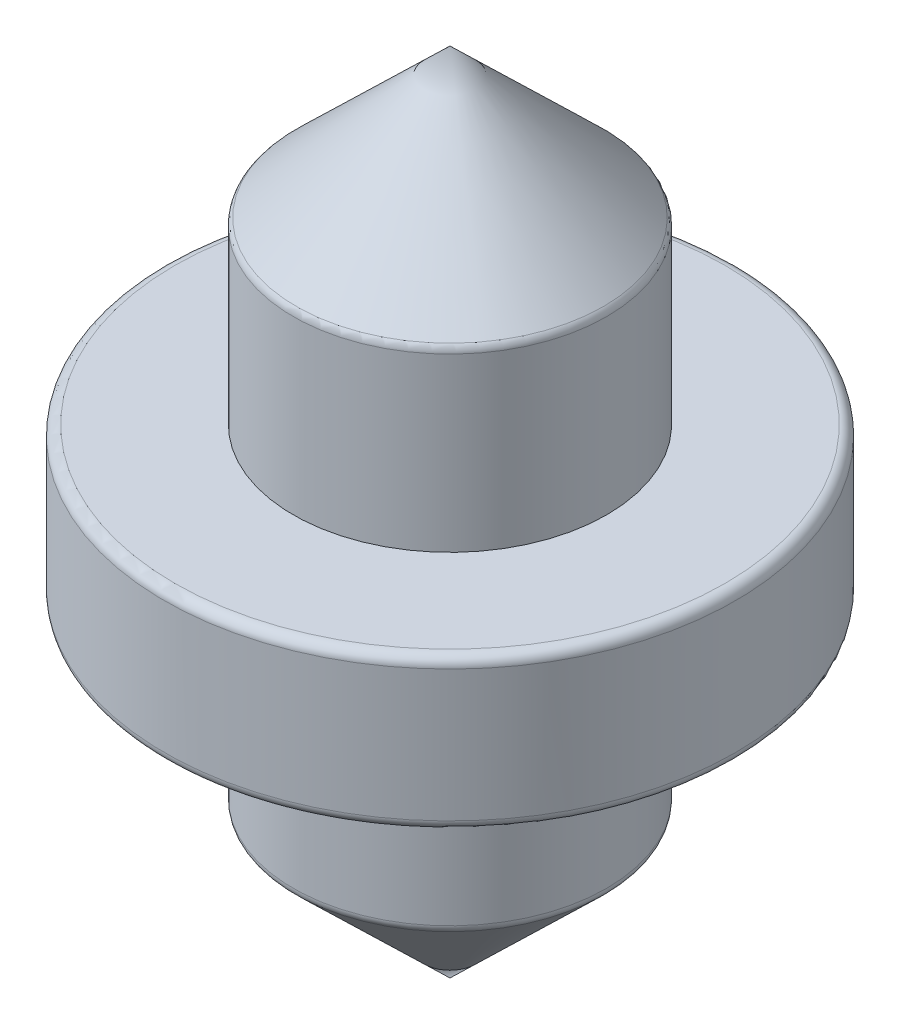
ISO-10303-21;
HEADER;
FILE_DESCRIPTION(('STEP AP214'),'2;1');
FILE_NAME('part.step','',(''),(''),'','','');
FILE_SCHEMA(('AUTOMOTIVE_DESIGN { 1 0 10303 214 1 1 1 1 }'));
ENDSEC;
DATA;
#1=APPLICATION_CONTEXT('core data for automotive mechanical design processes');
#2=APPLICATION_PROTOCOL_DEFINITION('international standard','automotive_design',2000,#1);
#3=PRODUCT_CONTEXT('',#1,'mechanical');
#4=PRODUCT('Part','Part','',(#3));
#5=PRODUCT_RELATED_PRODUCT_CATEGORY('part','',(#4));
#6=PRODUCT_DEFINITION_FORMATION('','',#4);
#7=PRODUCT_DEFINITION_CONTEXT('part definition',#1,'design');
#8=PRODUCT_DEFINITION('design','',#6,#7);
#9=PRODUCT_DEFINITION_SHAPE('','',#8);
#10=(LENGTH_UNIT() NAMED_UNIT(*) SI_UNIT(.MILLI.,.METRE.));
#11=(NAMED_UNIT(*) PLANE_ANGLE_UNIT() SI_UNIT($,.RADIAN.));
#12=(NAMED_UNIT(*) SI_UNIT($,.STERADIAN.) SOLID_ANGLE_UNIT());
#13=UNCERTAINTY_MEASURE_WITH_UNIT(LENGTH_MEASURE(1.E-05),#10,'distance_accuracy_value','');
#14=(GEOMETRIC_REPRESENTATION_CONTEXT(3) GLOBAL_UNCERTAINTY_ASSIGNED_CONTEXT((#13)) GLOBAL_UNIT_ASSIGNED_CONTEXT((#10,
#11,#12)) REPRESENTATION_CONTEXT('',''));
#15=CARTESIAN_POINT('',(0.,0.,0.));
#16=DIRECTION('',(0.,0.,1.));
#17=DIRECTION('',(1.,0.,0.));
#18=AXIS2_PLACEMENT_3D('',#15,#16,#17);
#19=CARTESIAN_POINT('',(0.,70.055695547363,0.));
#20=DIRECTION('',(0.,-1.,0.));
#21=DIRECTION('',(1.,0.,0.));
#22=AXIS2_PLACEMENT_3D('',#19,#20,#21);
#23=CONICAL_SURFACE('',#22,30.9919980147476,0.801661125583377);
#24=CARTESIAN_POINT('',(0.,70.6451751989933,0.));
#25=DIRECTION('',(0.,-1.,0.));
#26=DIRECTION('',(1.,0.,0.));
#27=AXIS2_PLACEMENT_3D('',#24,#25,#26);
#28=CIRCLE('',#27,30.383026274979);
#29=CARTESIAN_POINT('',(30.383026274979,70.6451751989933,0.));
#30=VERTEX_POINT('',#29);
#31=EDGE_CURVE('E82',#30,#30,#28,.F.);
#32=ORIENTED_EDGE('',*,*,#31,.T.);
#33=EDGE_LOOP('',(#32));
#34=FACE_BOUND('',#33,.T.);
#35=CARTESIAN_POINT('',(0.,100.055695547363,0.));
#36=VERTEX_POINT('',#35);
#37=VERTEX_LOOP('',#36);
#38=FACE_BOUND('',#37,.T.);
#39=ADVANCED_FACE('F35',(#34,#38),#23,.T.);
#40=CARTESIAN_POINT('',(0.,70.055695547363,0.));
#41=DIRECTION('',(0.,1.,0.));
#42=DIRECTION('',(-1.,0.,0.));
#43=AXIS2_PLACEMENT_3D('',#40,#41,#42);
#44=CYLINDRICAL_SURFACE('',#43,30.9919980147476);
#45=CARTESIAN_POINT('',(0.,69.2081503630083,0.));
#46=DIRECTION('',(0.,-1.,0.));
#47=DIRECTION('',(1.,0.,0.));
#48=AXIS2_PLACEMENT_3D('',#45,#46,#47);
#49=CIRCLE('',#48,30.9919980147476);
#50=CARTESIAN_POINT('',(30.9919980147476,69.2081503630083,0.));
#51=VERTEX_POINT('',#50);
#52=EDGE_CURVE('E80',#51,#51,#49,.T.);
#53=ORIENTED_EDGE('',*,*,#52,.T.);
#54=EDGE_LOOP('',(#53));
#55=FACE_BOUND('',#54,.T.);
#56=CARTESIAN_POINT('',(0.,35.2627921157125,0.));
#57=DIRECTION('',(0.,1.,0.));
#58=DIRECTION('',(-1.,0.,0.));
#59=AXIS2_PLACEMENT_3D('',#56,#57,#58);
#60=CIRCLE('',#59,30.9919980147476);
#61=CARTESIAN_POINT('',(-30.9919980147476,35.2627921157125,0.));
#62=VERTEX_POINT('',#61);
#63=EDGE_CURVE('E103',#62,#62,#60,.T.);
#64=ORIENTED_EDGE('',*,*,#63,.T.);
#65=EDGE_LOOP('',(#64));
#66=FACE_BOUND('',#65,.T.);
#67=ADVANCED_FACE('F50',(#55,#66),#44,.T.);
#68=CARTESIAN_POINT('',(0.,35.2627921157125,0.));
#69=DIRECTION('',(0.,1.,0.));
#70=DIRECTION('',(-1.,0.,0.));
#71=AXIS2_PLACEMENT_3D('',#68,#69,#70);
#72=PLANE('',#71);
#73=CARTESIAN_POINT('',(0.,35.2627921157125,0.));
#74=DIRECTION('',(0.,1.,0.));
#75=DIRECTION('',(-1.,0.,0.));
#76=AXIS2_PLACEMENT_3D('',#73,#74,#75);
#77=CIRCLE('',#76,54.4288265740216);
#78=CARTESIAN_POINT('',(-54.4288265740216,35.2627921157125,0.));
#79=VERTEX_POINT('',#78);
#80=EDGE_CURVE('E106',#79,#79,#77,.T.);
#81=ORIENTED_EDGE('',*,*,#80,.T.);
#82=EDGE_LOOP('',(#81));
#83=FACE_BOUND('',#82,.T.);
#84=ORIENTED_EDGE('',*,*,#63,.F.);
#85=EDGE_LOOP('',(#84));
#86=FACE_BOUND('',#85,.T.);
#87=ADVANCED_FACE('F56',(#83,#86),#72,.T.);
#88=CARTESIAN_POINT('',(0.,70.055695547363,0.));
#89=DIRECTION('',(0.,1.,0.));
#90=DIRECTION('',(-1.,0.,0.));
#91=AXIS2_PLACEMENT_3D('',#88,#89,#90);
#92=CYLINDRICAL_SURFACE('',#91,56.4288265740216);
#93=CARTESIAN_POINT('',(0.,7.26279211571246,0.));
#94=DIRECTION('',(0.,-1.,0.));
#95=DIRECTION('',(1.,0.,0.));
#96=AXIS2_PLACEMENT_3D('',#93,#94,#95);
#97=CIRCLE('',#96,56.4288265740216);
#98=CARTESIAN_POINT('',(56.4288265740216,7.26279211571246,0.));
#99=VERTEX_POINT('',#98);
#100=EDGE_CURVE('E87',#99,#99,#97,.F.);
#101=ORIENTED_EDGE('',*,*,#100,.T.);
#102=EDGE_LOOP('',(#101));
#103=FACE_BOUND('',#102,.T.);
#104=CARTESIAN_POINT('',(0.,33.2627921157125,0.));
#105=DIRECTION('',(0.,1.,0.));
#106=DIRECTION('',(-1.,0.,0.));
#107=AXIS2_PLACEMENT_3D('',#104,#105,#106);
#108=CIRCLE('',#107,56.4288265740216);
#109=CARTESIAN_POINT('',(-56.4288265740216,33.2627921157125,0.));
#110=VERTEX_POINT('',#109);
#111=EDGE_CURVE('E111',#110,#110,#108,.F.);
#112=ORIENTED_EDGE('',*,*,#111,.T.);
#113=EDGE_LOOP('',(#112));
#114=FACE_BOUND('',#113,.T.);
#115=ADVANCED_FACE('F116',(#103,#114),#92,.T.);
#116=CARTESIAN_POINT('',(0.,5.26279211571246,0.));
#117=DIRECTION('',(0.,-1.,0.));
#118=DIRECTION('',(1.,0.,0.));
#119=AXIS2_PLACEMENT_3D('',#116,#117,#118);
#120=PLANE('',#119);
#121=CARTESIAN_POINT('',(0.,5.26279211571246,0.));
#122=DIRECTION('',(0.,-1.,0.));
#123=DIRECTION('',(1.,0.,0.));
#124=AXIS2_PLACEMENT_3D('',#121,#122,#123);
#125=CIRCLE('',#124,54.4288265740216);
#126=CARTESIAN_POINT('',(54.4288265740216,5.26279211571246,0.));
#127=VERTEX_POINT('',#126);
#128=EDGE_CURVE('E83',#127,#127,#125,.T.);
#129=ORIENTED_EDGE('',*,*,#128,.T.);
#130=EDGE_LOOP('',(#129));
#131=FACE_BOUND('',#130,.T.);
#132=CARTESIAN_POINT('',(0.,5.26279211571246,0.));
#133=DIRECTION('',(0.,1.,0.));
#134=DIRECTION('',(-1.,0.,0.));
#135=AXIS2_PLACEMENT_3D('',#132,#133,#134);
#136=CIRCLE('',#135,30.9919980147476);
#137=CARTESIAN_POINT('',(-30.9919980147476,5.26279211571246,0.));
#138=VERTEX_POINT('',#137);
#139=EDGE_CURVE('E101',#138,#138,#136,.T.);
#140=ORIENTED_EDGE('',*,*,#139,.T.);
#141=EDGE_LOOP('',(#140));
#142=FACE_BOUND('',#141,.T.);
#143=ADVANCED_FACE('F97',(#131,#142),#120,.T.);
#144=CARTESIAN_POINT('',(0.,70.055695547363,0.));
#145=DIRECTION('',(0.,1.,0.));
#146=DIRECTION('',(-1.,0.,0.));
#147=AXIS2_PLACEMENT_3D('',#144,#145,#146);
#148=CYLINDRICAL_SURFACE('',#147,30.9919980147476);
#149=CARTESIAN_POINT('',(0.,-28.6825661315834,0.));
#150=DIRECTION('',(0.,-1.,0.));
#151=DIRECTION('',(1.,0.,0.));
#152=AXIS2_PLACEMENT_3D('',#149,#150,#151);
#153=CIRCLE('',#152,30.9919980147476);
#154=CARTESIAN_POINT('',(30.9919980147476,-28.6825661315834,0.));
#155=VERTEX_POINT('',#154);
#156=EDGE_CURVE('E43',#155,#155,#153,.F.);
#157=ORIENTED_EDGE('',*,*,#156,.T.);
#158=EDGE_LOOP('',(#157));
#159=FACE_BOUND('',#158,.T.);
#160=ORIENTED_EDGE('',*,*,#139,.F.);
#161=EDGE_LOOP('',(#160));
#162=FACE_BOUND('',#161,.T.);
#163=ADVANCED_FACE('F93',(#159,#162),#148,.T.);
#164=CARTESIAN_POINT('',(0.,-29.5301113159381,0.));
#165=DIRECTION('',(0.,1.,0.));
#166=DIRECTION('',(-1.,0.,0.));
#167=AXIS2_PLACEMENT_3D('',#164,#165,#166);
#168=CONICAL_SURFACE('',#167,30.9919980147476,0.801661125583366);
#169=CARTESIAN_POINT('',(0.,-30.1195909675684,0.));
#170=DIRECTION('',(0.,-1.,0.));
#171=DIRECTION('',(1.,0.,0.));
#172=AXIS2_PLACEMENT_3D('',#169,#170,#171);
#173=CIRCLE('',#172,30.383026274979);
#174=CARTESIAN_POINT('',(30.383026274979,-30.1195909675684,0.));
#175=VERTEX_POINT('',#174);
#176=EDGE_CURVE('E11',#175,#175,#173,.T.);
#177=ORIENTED_EDGE('',*,*,#176,.T.);
#178=EDGE_LOOP('',(#177));
#179=FACE_BOUND('',#178,.T.);
#180=CARTESIAN_POINT('',(0.,-59.5301113159388,0.));
#181=VERTEX_POINT('',#180);
#182=VERTEX_LOOP('',#181);
#183=FACE_BOUND('',#182,.T.);
#184=ADVANCED_FACE('F66',(#179,#183),#168,.T.);
#185=CARTESIAN_POINT('',(0.,33.2627921157125,0.));
#186=DIRECTION('',(0.,1.,0.));
#187=DIRECTION('',(-1.,0.,0.));
#188=AXIS2_PLACEMENT_3D('',#185,#186,#187);
#189=TOROIDAL_SURFACE('',#188,54.4288265740216,2.);
#190=ORIENTED_EDGE('',*,*,#111,.F.);
#191=EDGE_LOOP('',(#190));
#192=FACE_BOUND('',#191,.T.);
#193=ORIENTED_EDGE('',*,*,#80,.F.);
#194=EDGE_LOOP('',(#193));
#195=FACE_BOUND('',#194,.T.);
#196=ADVANCED_FACE('F62',(#192,#195),#189,.T.);
#197=CARTESIAN_POINT('',(0.,7.26279211571246,0.));
#198=DIRECTION('',(0.,-1.,0.));
#199=DIRECTION('',(1.,0.,0.));
#200=AXIS2_PLACEMENT_3D('',#197,#198,#199);
#201=TOROIDAL_SURFACE('',#200,54.4288265740216,2.);
#202=ORIENTED_EDGE('',*,*,#128,.F.);
#203=EDGE_LOOP('',(#202));
#204=FACE_BOUND('',#203,.T.);
#205=ORIENTED_EDGE('',*,*,#100,.F.);
#206=EDGE_LOOP('',(#205));
#207=FACE_BOUND('',#206,.T.);
#208=ADVANCED_FACE('F65',(#204,#207),#201,.T.);
#209=CARTESIAN_POINT('',(0.,69.2081503630083,0.));
#210=DIRECTION('',(0.,-1.,0.));
#211=DIRECTION('',(1.,0.,0.));
#212=AXIS2_PLACEMENT_3D('',#209,#210,#211);
#213=TOROIDAL_SURFACE('',#212,28.9919980147476,2.);
#214=ORIENTED_EDGE('',*,*,#52,.F.);
#215=EDGE_LOOP('',(#214));
#216=FACE_BOUND('',#215,.T.);
#217=ORIENTED_EDGE('',*,*,#31,.F.);
#218=EDGE_LOOP('',(#217));
#219=FACE_BOUND('',#218,.T.);
#220=ADVANCED_FACE('F69',(#216,#219),#213,.T.);
#221=CARTESIAN_POINT('',(0.,-28.6825661315834,0.));
#222=DIRECTION('',(0.,-1.,0.));
#223=DIRECTION('',(1.,0.,0.));
#224=AXIS2_PLACEMENT_3D('',#221,#222,#223);
#225=TOROIDAL_SURFACE('',#224,28.9919980147476,2.);
#226=ORIENTED_EDGE('',*,*,#176,.F.);
#227=EDGE_LOOP('',(#226));
#228=FACE_BOUND('',#227,.T.);
#229=ORIENTED_EDGE('',*,*,#156,.F.);
#230=EDGE_LOOP('',(#229));
#231=FACE_BOUND('',#230,.T.);
#232=ADVANCED_FACE('F37',(#228,#231),#225,.T.);
#233=CLOSED_SHELL('',(#39,#67,#87,#115,#143,#163,#184,#196,#208,#220,#232));
#234=MANIFOLD_SOLID_BREP('B2',#233);
#235=ADVANCED_BREP_SHAPE_REPRESENTATION('',(#18,#234),#14);
#236=SHAPE_DEFINITION_REPRESENTATION(#9,#235);
ENDSEC;
END-ISO-10303-21;
